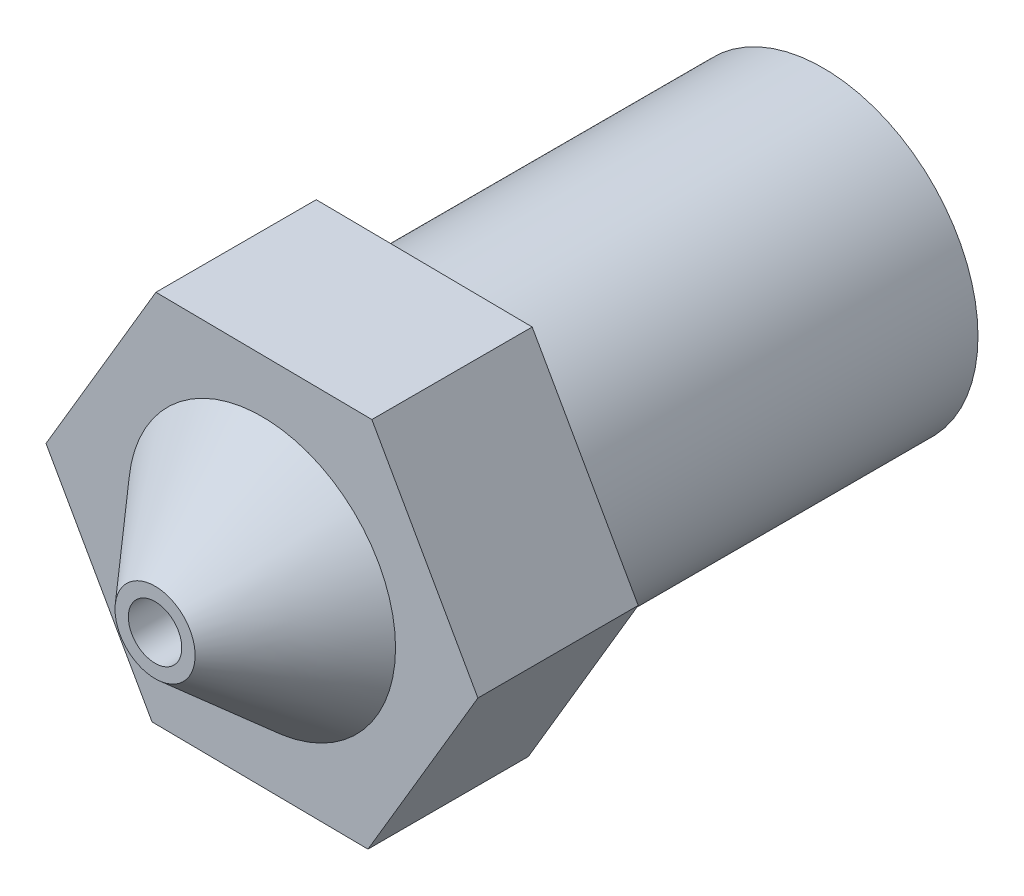
ISO-10303-21;
HEADER;
FILE_DESCRIPTION(('STEP AP214'),'2;1');
FILE_NAME('part.step','',(''),(''),'','','');
FILE_SCHEMA(('AUTOMOTIVE_DESIGN { 1 0 10303 214 1 1 1 1 }'));
ENDSEC;
DATA;
#1=APPLICATION_CONTEXT('core data for automotive mechanical design processes');
#2=APPLICATION_PROTOCOL_DEFINITION('international standard','automotive_design',2000,#1);
#3=PRODUCT_CONTEXT('',#1,'mechanical');
#4=PRODUCT('Part','Part','',(#3));
#5=PRODUCT_RELATED_PRODUCT_CATEGORY('part','',(#4));
#6=PRODUCT_DEFINITION_FORMATION('','',#4);
#7=PRODUCT_DEFINITION_CONTEXT('part definition',#1,'design');
#8=PRODUCT_DEFINITION('design','',#6,#7);
#9=PRODUCT_DEFINITION_SHAPE('','',#8);
#10=(LENGTH_UNIT() NAMED_UNIT(*) SI_UNIT(.MILLI.,.METRE.));
#11=(NAMED_UNIT(*) PLANE_ANGLE_UNIT() SI_UNIT($,.RADIAN.));
#12=(NAMED_UNIT(*) SI_UNIT($,.STERADIAN.) SOLID_ANGLE_UNIT());
#13=UNCERTAINTY_MEASURE_WITH_UNIT(LENGTH_MEASURE(1.E-05),#10,'distance_accuracy_value','');
#14=(GEOMETRIC_REPRESENTATION_CONTEXT(3) GLOBAL_UNCERTAINTY_ASSIGNED_CONTEXT((#13)) GLOBAL_UNIT_ASSIGNED_CONTEXT((#10,
#11,#12)) REPRESENTATION_CONTEXT('',''));
#15=CARTESIAN_POINT('',(0.,0.,0.));
#16=DIRECTION('',(0.,0.,1.));
#17=DIRECTION('',(1.,0.,0.));
#18=AXIS2_PLACEMENT_3D('',#15,#16,#17);
#19=CARTESIAN_POINT('',(-4.04123017720206,0.0423318816588313,3.));
#20=DIRECTION('',(0.871215107244233,0.490901453358432,0.));
#21=DIRECTION('',(-0.490901453358432,0.871215107244233,0.));
#22=AXIS2_PLACEMENT_3D('',#19,#20,#21);
#23=PLANE('',#22);
#24=DIRECTION('',(0.490901453358432,-0.871215107244232,0.));
#25=VECTOR('',#24,1.);
#26=CARTESIAN_POINT('',(-4.04123017720206,0.0423318816588313,0.));
#27=LINE('',#26,#25);
#28=CARTESIAN_POINT('',(-4.04123017720206,0.0423318816588313,0.));
#29=VERTEX_POINT('',#28);
#30=CARTESIAN_POINT('',(-2.05727557350757,-3.47864205516785,0.));
#31=VERTEX_POINT('',#30);
#32=EDGE_CURVE('E125',#29,#31,#27,.T.);
#33=ORIENTED_EDGE('',*,*,#32,.T.);
#34=DIRECTION('',(0.,0.,-1.));
#35=VECTOR('',#34,1.);
#36=CARTESIAN_POINT('',(-2.05727557350757,-3.47864205516785,3.));
#37=LINE('',#36,#35);
#38=CARTESIAN_POINT('',(-2.05727557350757,-3.47864205516785,3.));
#39=VERTEX_POINT('',#38);
#40=EDGE_CURVE('E42',#39,#31,#37,.T.);
#41=ORIENTED_EDGE('',*,*,#40,.F.);
#42=DIRECTION('',(0.490901453358432,-0.871215107244232,0.));
#43=VECTOR('',#42,1.);
#44=CARTESIAN_POINT('',(-4.04123017720206,0.0423318816588313,3.));
#45=LINE('',#44,#43);
#46=CARTESIAN_POINT('',(-4.04123017720206,0.0423318816588313,3.));
#47=VERTEX_POINT('',#46);
#48=EDGE_CURVE('E136',#47,#39,#45,.T.);
#49=ORIENTED_EDGE('',*,*,#48,.F.);
#50=DIRECTION('',(0.,0.,-1.));
#51=VECTOR('',#50,1.);
#52=CARTESIAN_POINT('',(-4.04123017720206,0.0423318816588313,3.));
#53=LINE('',#52,#51);
#54=EDGE_CURVE('E121',#47,#29,#53,.T.);
#55=ORIENTED_EDGE('',*,*,#54,.T.);
#56=EDGE_LOOP('',(#33,#41,#49,#55));
#57=FACE_BOUND('',#56,.T.);
#58=ADVANCED_FACE('F39',(#57),#23,.F.);
#59=CARTESIAN_POINT('',(-2.05727557350757,-3.47864205516785,3.));
#60=DIRECTION('',(0.0104744242590129,0.999945141713505,0.));
#61=DIRECTION('',(-0.999945141713505,0.0104744242590129,0.));
#62=AXIS2_PLACEMENT_3D('',#59,#60,#61);
#63=PLANE('',#62);
#64=DIRECTION('',(0.999945141713505,-0.0104744242590129,0.));
#65=VECTOR('',#64,1.);
#66=CARTESIAN_POINT('',(-2.05727557350757,-3.47864205516785,0.));
#67=LINE('',#66,#65);
#68=CARTESIAN_POINT('',(1.98395460369448,-3.52097393682668,0.));
#69=VERTEX_POINT('',#68);
#70=EDGE_CURVE('E128',#31,#69,#67,.T.);
#71=ORIENTED_EDGE('',*,*,#70,.T.);
#72=DIRECTION('',(0.,0.,-1.));
#73=VECTOR('',#72,1.);
#74=CARTESIAN_POINT('',(1.98395460369448,-3.52097393682668,3.));
#75=LINE('',#74,#73);
#76=CARTESIAN_POINT('',(1.98395460369448,-3.52097393682668,3.));
#77=VERTEX_POINT('',#76);
#78=EDGE_CURVE('E139',#77,#69,#75,.T.);
#79=ORIENTED_EDGE('',*,*,#78,.F.);
#80=DIRECTION('',(0.999945141713505,-0.0104744242590129,0.));
#81=VECTOR('',#80,1.);
#82=CARTESIAN_POINT('',(-2.05727557350757,-3.47864205516785,3.));
#83=LINE('',#82,#81);
#84=EDGE_CURVE('E94',#39,#77,#83,.T.);
#85=ORIENTED_EDGE('',*,*,#84,.F.);
#86=ORIENTED_EDGE('',*,*,#40,.T.);
#87=EDGE_LOOP('',(#71,#79,#85,#86));
#88=FACE_BOUND('',#87,.T.);
#89=ADVANCED_FACE('F144',(#88),#63,.F.);
#90=CARTESIAN_POINT('',(1.98395460369448,-3.52097393682668,3.));
#91=DIRECTION('',(-0.86074068298522,0.509043688355074,0.));
#92=DIRECTION('',(-0.509043688355074,-0.86074068298522,0.));
#93=AXIS2_PLACEMENT_3D('',#90,#91,#92);
#94=PLANE('',#93);
#95=DIRECTION('',(0.509043688355074,0.86074068298522,0.));
#96=VECTOR('',#95,1.);
#97=CARTESIAN_POINT('',(1.98395460369448,-3.52097393682668,0.));
#98=LINE('',#97,#96);
#99=CARTESIAN_POINT('',(4.04123017720205,-0.0423318816588313,0.));
#100=VERTEX_POINT('',#99);
#101=EDGE_CURVE('E131',#69,#100,#98,.T.);
#102=ORIENTED_EDGE('',*,*,#101,.T.);
#103=DIRECTION('',(0.,0.,-1.));
#104=VECTOR('',#103,1.);
#105=CARTESIAN_POINT('',(4.04123017720205,-0.0423318816588313,3.));
#106=LINE('',#105,#104);
#107=CARTESIAN_POINT('',(4.04123017720205,-0.0423318816588313,3.));
#108=VERTEX_POINT('',#107);
#109=EDGE_CURVE('E116',#108,#100,#106,.T.);
#110=ORIENTED_EDGE('',*,*,#109,.F.);
#111=DIRECTION('',(0.509043688355074,0.86074068298522,0.));
#112=VECTOR('',#111,1.);
#113=CARTESIAN_POINT('',(1.98395460369448,-3.52097393682668,3.));
#114=LINE('',#113,#112);
#115=EDGE_CURVE('E107',#77,#108,#114,.T.);
#116=ORIENTED_EDGE('',*,*,#115,.F.);
#117=ORIENTED_EDGE('',*,*,#78,.T.);
#118=EDGE_LOOP('',(#102,#110,#116,#117));
#119=FACE_BOUND('',#118,.T.);
#120=ADVANCED_FACE('F150',(#119),#94,.F.);
#121=CARTESIAN_POINT('',(4.04123017720205,-0.0423318816588313,3.));
#122=DIRECTION('',(-0.871215107244233,-0.490901453358432,0.));
#123=DIRECTION('',(0.490901453358432,-0.871215107244233,0.));
#124=AXIS2_PLACEMENT_3D('',#121,#122,#123);
#125=PLANE('',#124);
#126=DIRECTION('',(-0.490901453358432,0.871215107244233,0.));
#127=VECTOR('',#126,1.);
#128=CARTESIAN_POINT('',(4.04123017720205,-0.0423318816588313,0.));
#129=LINE('',#128,#127);
#130=CARTESIAN_POINT('',(2.05727557350757,3.47864205516785,0.));
#131=VERTEX_POINT('',#130);
#132=EDGE_CURVE('E115',#100,#131,#129,.T.);
#133=ORIENTED_EDGE('',*,*,#132,.T.);
#134=DIRECTION('',(0.,0.,-1.));
#135=VECTOR('',#134,1.);
#136=CARTESIAN_POINT('',(2.05727557350757,3.47864205516785,3.));
#137=LINE('',#136,#135);
#138=CARTESIAN_POINT('',(2.05727557350757,3.47864205516785,3.));
#139=VERTEX_POINT('',#138);
#140=EDGE_CURVE('E112',#139,#131,#137,.T.);
#141=ORIENTED_EDGE('',*,*,#140,.F.);
#142=DIRECTION('',(-0.490901453358432,0.871215107244233,0.));
#143=VECTOR('',#142,1.);
#144=CARTESIAN_POINT('',(4.04123017720205,-0.0423318816588313,3.));
#145=LINE('',#144,#143);
#146=EDGE_CURVE('E101',#108,#139,#145,.T.);
#147=ORIENTED_EDGE('',*,*,#146,.F.);
#148=ORIENTED_EDGE('',*,*,#109,.T.);
#149=EDGE_LOOP('',(#133,#141,#147,#148));
#150=FACE_BOUND('',#149,.T.);
#151=ADVANCED_FACE('F113',(#150),#125,.F.);
#152=CARTESIAN_POINT('',(2.05727557350757,3.47864205516785,3.));
#153=DIRECTION('',(-0.0104744242590133,-0.999945141713505,0.));
#154=DIRECTION('',(0.999945141713505,-0.0104744242590133,0.));
#155=AXIS2_PLACEMENT_3D('',#152,#153,#154);
#156=PLANE('',#155);
#157=DIRECTION('',(-0.999945141713505,0.0104744242590133,0.));
#158=VECTOR('',#157,1.);
#159=CARTESIAN_POINT('',(2.05727557350757,3.47864205516785,0.));
#160=LINE('',#159,#158);
#161=CARTESIAN_POINT('',(-1.98395460369448,3.52097393682669,0.));
#162=VERTEX_POINT('',#161);
#163=EDGE_CURVE('E79',#131,#162,#160,.T.);
#164=ORIENTED_EDGE('',*,*,#163,.T.);
#165=DIRECTION('',(0.,0.,-1.));
#166=VECTOR('',#165,1.);
#167=CARTESIAN_POINT('',(-1.98395460369448,3.52097393682669,3.));
#168=LINE('',#167,#166);
#169=CARTESIAN_POINT('',(-1.98395460369448,3.52097393682669,3.));
#170=VERTEX_POINT('',#169);
#171=EDGE_CURVE('E117',#170,#162,#168,.T.);
#172=ORIENTED_EDGE('',*,*,#171,.F.);
#173=DIRECTION('',(-0.999945141713505,0.0104744242590133,0.));
#174=VECTOR('',#173,1.);
#175=CARTESIAN_POINT('',(2.05727557350757,3.47864205516785,3.));
#176=LINE('',#175,#174);
#177=EDGE_CURVE('E105',#139,#170,#176,.T.);
#178=ORIENTED_EDGE('',*,*,#177,.F.);
#179=ORIENTED_EDGE('',*,*,#140,.T.);
#180=EDGE_LOOP('',(#164,#172,#178,#179));
#181=FACE_BOUND('',#180,.T.);
#182=ADVANCED_FACE('F119',(#181),#156,.F.);
#183=CARTESIAN_POINT('',(-1.98395460369448,3.52097393682669,3.));
#184=DIRECTION('',(0.86074068298522,-0.509043688355074,0.));
#185=DIRECTION('',(0.509043688355074,0.86074068298522,0.));
#186=AXIS2_PLACEMENT_3D('',#183,#184,#185);
#187=PLANE('',#186);
#188=DIRECTION('',(-0.509043688355074,-0.86074068298522,0.));
#189=VECTOR('',#188,1.);
#190=CARTESIAN_POINT('',(-1.98395460369448,3.52097393682669,0.));
#191=LINE('',#190,#189);
#192=EDGE_CURVE('E85',#162,#29,#191,.T.);
#193=ORIENTED_EDGE('',*,*,#192,.T.);
#194=ORIENTED_EDGE('',*,*,#54,.F.);
#195=DIRECTION('',(-0.509043688355074,-0.86074068298522,0.));
#196=VECTOR('',#195,1.);
#197=CARTESIAN_POINT('',(-1.98395460369448,3.52097393682669,3.));
#198=LINE('',#197,#196);
#199=EDGE_CURVE('E56',#170,#47,#198,.T.);
#200=ORIENTED_EDGE('',*,*,#199,.F.);
#201=ORIENTED_EDGE('',*,*,#171,.T.);
#202=EDGE_LOOP('',(#193,#194,#200,#201));
#203=FACE_BOUND('',#202,.T.);
#204=ADVANCED_FACE('F205',(#203),#187,.F.);
#205=CARTESIAN_POINT('',(0.,0.,3.));
#206=DIRECTION('',(0.,0.,1.));
#207=DIRECTION('',(1.,0.,0.));
#208=AXIS2_PLACEMENT_3D('',#205,#206,#207);
#209=PLANE('',#208);
#210=CARTESIAN_POINT('',(0.,0.,3.));
#211=DIRECTION('',(0.,0.,-1.));
#212=DIRECTION('',(-1.,0.,0.));
#213=AXIS2_PLACEMENT_3D('',#210,#211,#212);
#214=CIRCLE('',#213,2.5);
#215=CARTESIAN_POINT('',(-2.5,0.,3.));
#216=VERTEX_POINT('',#215);
#217=EDGE_CURVE('E159',#216,#216,#214,.T.);
#218=ORIENTED_EDGE('',*,*,#217,.T.);
#219=EDGE_LOOP('',(#218));
#220=FACE_BOUND('',#219,.T.);
#221=ORIENTED_EDGE('',*,*,#48,.T.);
#222=ORIENTED_EDGE('',*,*,#84,.T.);
#223=ORIENTED_EDGE('',*,*,#115,.T.);
#224=ORIENTED_EDGE('',*,*,#146,.T.);
#225=ORIENTED_EDGE('',*,*,#177,.T.);
#226=ORIENTED_EDGE('',*,*,#199,.T.);
#227=EDGE_LOOP('',(#221,#222,#223,#224,#225,#226));
#228=FACE_BOUND('',#227,.T.);
#229=ADVANCED_FACE('F103',(#220,#228),#209,.T.);
#230=CARTESIAN_POINT('',(0.,0.,0.));
#231=DIRECTION('',(0.,0.,1.));
#232=DIRECTION('',(1.,0.,0.));
#233=AXIS2_PLACEMENT_3D('',#230,#231,#232);
#234=PLANE('',#233);
#235=CARTESIAN_POINT('',(0.,0.,0.));
#236=DIRECTION('',(0.,0.,-1.));
#237=DIRECTION('',(-1.,0.,0.));
#238=AXIS2_PLACEMENT_3D('',#235,#236,#237);
#239=CIRCLE('',#238,2.9);
#240=CARTESIAN_POINT('',(-2.9,0.,0.));
#241=VERTEX_POINT('',#240);
#242=EDGE_CURVE('E11',#241,#241,#239,.T.);
#243=ORIENTED_EDGE('',*,*,#242,.F.);
#244=EDGE_LOOP('',(#243));
#245=FACE_BOUND('',#244,.T.);
#246=ORIENTED_EDGE('',*,*,#32,.F.);
#247=ORIENTED_EDGE('',*,*,#192,.F.);
#248=ORIENTED_EDGE('',*,*,#163,.F.);
#249=ORIENTED_EDGE('',*,*,#132,.F.);
#250=ORIENTED_EDGE('',*,*,#101,.F.);
#251=ORIENTED_EDGE('',*,*,#70,.F.);
#252=EDGE_LOOP('',(#246,#247,#248,#249,#250,#251));
#253=FACE_BOUND('',#252,.T.);
#254=ADVANCED_FACE('F149',(#245,#253),#234,.F.);
#255=CARTESIAN_POINT('',(0.,0.,0.));
#256=DIRECTION('',(0.,0.,-1.));
#257=DIRECTION('',(-1.,0.,0.));
#258=AXIS2_PLACEMENT_3D('',#255,#256,#257);
#259=CYLINDRICAL_SURFACE('',#258,0.5);
#260=CARTESIAN_POINT('',(0.,0.,3.));
#261=DIRECTION('',(0.,0.,-1.));
#262=DIRECTION('',(-1.,0.,0.));
#263=AXIS2_PLACEMENT_3D('',#260,#261,#262);
#264=CIRCLE('',#263,0.5);
#265=CARTESIAN_POINT('',(-0.5,0.,3.));
#266=VERTEX_POINT('',#265);
#267=EDGE_CURVE('E163',#266,#266,#264,.T.);
#268=ORIENTED_EDGE('',*,*,#267,.T.);
#269=EDGE_LOOP('',(#268));
#270=FACE_BOUND('',#269,.T.);
#271=CARTESIAN_POINT('',(0.,0.,5.));
#272=DIRECTION('',(0.,0.,-1.));
#273=DIRECTION('',(-1.,0.,0.));
#274=AXIS2_PLACEMENT_3D('',#271,#272,#273);
#275=CIRCLE('',#274,0.5);
#276=CARTESIAN_POINT('',(-0.499999999999999,0.,5.));
#277=VERTEX_POINT('',#276);
#278=EDGE_CURVE('E129',#277,#277,#275,.T.);
#279=ORIENTED_EDGE('',*,*,#278,.F.);
#280=EDGE_LOOP('',(#279));
#281=FACE_BOUND('',#280,.T.);
#282=ADVANCED_FACE('F185',(#270,#281),#259,.F.);
#283=CARTESIAN_POINT('',(-0.499999999999999,0.,5.));
#284=DIRECTION('',(0.,0.,1.));
#285=DIRECTION('',(1.,0.,0.));
#286=AXIS2_PLACEMENT_3D('',#283,#284,#285);
#287=PLANE('',#286);
#288=ORIENTED_EDGE('',*,*,#278,.T.);
#289=EDGE_LOOP('',(#288));
#290=FACE_BOUND('',#289,.T.);
#291=CARTESIAN_POINT('',(0.,0.,5.));
#292=DIRECTION('',(0.,0.,-1.));
#293=DIRECTION('',(-1.,0.,0.));
#294=AXIS2_PLACEMENT_3D('',#291,#292,#293);
#295=CIRCLE('',#294,0.75);
#296=CARTESIAN_POINT('',(-0.749999999999999,0.,5.));
#297=VERTEX_POINT('',#296);
#298=EDGE_CURVE('E156',#297,#297,#295,.T.);
#299=ORIENTED_EDGE('',*,*,#298,.F.);
#300=EDGE_LOOP('',(#299));
#301=FACE_BOUND('',#300,.T.);
#302=ADVANCED_FACE('F188',(#290,#301),#287,.T.);
#303=CARTESIAN_POINT('',(0.,0.,3.));
#304=DIRECTION('',(0.,0.,-1.));
#305=DIRECTION('',(-1.,0.,0.));
#306=AXIS2_PLACEMENT_3D('',#303,#304,#305);
#307=CONICAL_SURFACE('',#306,2.5,0.718829999621625);
#308=CARTESIAN_POINT('',(-0.749999999999999,0.,5.));
#309=CARTESIAN_POINT('',(-0.768229166666666,0.,4.97916666666667));
#310=CARTESIAN_POINT('',(-0.786458333333332,0.,4.95833333333333));
#311=CARTESIAN_POINT('',(-0.822916666666666,0.,4.91666666666667));
#312=CARTESIAN_POINT('',(-0.841145833333332,0.,4.89583333333333));
#313=CARTESIAN_POINT('',(-0.877604166666666,0.,4.85416666666667));
#314=CARTESIAN_POINT('',(-0.895833333333332,0.,4.83333333333333));
#315=CARTESIAN_POINT('',(-0.932291666666666,0.,4.79166666666667));
#316=CARTESIAN_POINT('',(-0.950520833333332,0.,4.77083333333333));
#317=CARTESIAN_POINT('',(-0.986979166666666,0.,4.72916666666667));
#318=CARTESIAN_POINT('',(-1.00520833333333,0.,4.70833333333333));
#319=CARTESIAN_POINT('',(-1.04166666666667,0.,4.66666666666667));
#320=CARTESIAN_POINT('',(-1.05989583333333,0.,4.64583333333333));
#321=CARTESIAN_POINT('',(-1.09635416666667,0.,4.60416666666667));
#322=CARTESIAN_POINT('',(-1.11458333333333,0.,4.58333333333333));
#323=CARTESIAN_POINT('',(-1.15104166666667,0.,4.54166666666667));
#324=CARTESIAN_POINT('',(-1.16927083333333,0.,4.52083333333333));
#325=CARTESIAN_POINT('',(-1.20572916666667,0.,4.47916666666667));
#326=CARTESIAN_POINT('',(-1.22395833333333,0.,4.45833333333333));
#327=CARTESIAN_POINT('',(-1.26041666666667,0.,4.41666666666667));
#328=CARTESIAN_POINT('',(-1.27864583333333,0.,4.39583333333333));
#329=CARTESIAN_POINT('',(-1.31510416666667,0.,4.35416666666667));
#330=CARTESIAN_POINT('',(-1.33333333333333,0.,4.33333333333333));
#331=CARTESIAN_POINT('',(-1.36979166666667,0.,4.29166666666667));
#332=CARTESIAN_POINT('',(-1.38802083333333,0.,4.27083333333333));
#333=CARTESIAN_POINT('',(-1.42447916666667,0.,4.22916666666667));
#334=CARTESIAN_POINT('',(-1.44270833333333,0.,4.20833333333333));
#335=CARTESIAN_POINT('',(-1.47916666666667,0.,4.16666666666667));
#336=CARTESIAN_POINT('',(-1.49739583333333,0.,4.14583333333333));
#337=CARTESIAN_POINT('',(-1.53385416666667,0.,4.10416666666667));
#338=CARTESIAN_POINT('',(-1.55208333333333,0.,4.08333333333333));
#339=CARTESIAN_POINT('',(-1.58854166666667,0.,4.04166666666667));
#340=CARTESIAN_POINT('',(-1.60677083333333,0.,4.02083333333333));
#341=CARTESIAN_POINT('',(-1.64322916666667,0.,3.97916666666667));
#342=CARTESIAN_POINT('',(-1.66145833333333,0.,3.95833333333333));
#343=CARTESIAN_POINT('',(-1.69791666666667,0.,3.91666666666667));
#344=CARTESIAN_POINT('',(-1.71614583333333,0.,3.89583333333333));
#345=CARTESIAN_POINT('',(-1.75260416666667,0.,3.85416666666667));
#346=CARTESIAN_POINT('',(-1.77083333333333,0.,3.83333333333333));
#347=CARTESIAN_POINT('',(-1.80729166666667,0.,3.79166666666667));
#348=CARTESIAN_POINT('',(-1.82552083333333,0.,3.77083333333333));
#349=CARTESIAN_POINT('',(-1.86197916666667,0.,3.72916666666667));
#350=CARTESIAN_POINT('',(-1.88020833333333,0.,3.70833333333333));
#351=CARTESIAN_POINT('',(-1.91666666666667,0.,3.66666666666667));
#352=CARTESIAN_POINT('',(-1.93489583333333,0.,3.64583333333333));
#353=CARTESIAN_POINT('',(-1.97135416666667,0.,3.60416666666667));
#354=CARTESIAN_POINT('',(-1.98958333333333,0.,3.58333333333333));
#355=CARTESIAN_POINT('',(-2.02604166666667,0.,3.54166666666667));
#356=CARTESIAN_POINT('',(-2.04427083333333,0.,3.52083333333333));
#357=CARTESIAN_POINT('',(-2.08072916666667,0.,3.47916666666667));
#358=CARTESIAN_POINT('',(-2.09895833333333,0.,3.45833333333333));
#359=CARTESIAN_POINT('',(-2.13541666666667,0.,3.41666666666667));
#360=CARTESIAN_POINT('',(-2.15364583333333,0.,3.39583333333333));
#361=CARTESIAN_POINT('',(-2.19010416666667,0.,3.35416666666667));
#362=CARTESIAN_POINT('',(-2.20833333333333,0.,3.33333333333333));
#363=CARTESIAN_POINT('',(-2.24479166666667,0.,3.29166666666667));
#364=CARTESIAN_POINT('',(-2.26302083333333,0.,3.27083333333333));
#365=CARTESIAN_POINT('',(-2.29947916666667,0.,3.22916666666667));
#366=CARTESIAN_POINT('',(-2.31770833333333,0.,3.20833333333333));
#367=CARTESIAN_POINT('',(-2.35416666666667,0.,3.16666666666667));
#368=CARTESIAN_POINT('',(-2.37239583333333,0.,3.14583333333333));
#369=CARTESIAN_POINT('',(-2.40885416666667,0.,3.10416666666667));
#370=CARTESIAN_POINT('',(-2.42708333333333,0.,3.08333333333333));
#371=CARTESIAN_POINT('',(-2.46354166666667,0.,3.04166666666667));
#372=CARTESIAN_POINT('',(-2.48177083333333,0.,3.02083333333333));
#373=CARTESIAN_POINT('',(-2.5,0.,3.));
#374=B_SPLINE_CURVE_WITH_KNOTS('',3,(#308,#309,#310,#311,#312,#313,#314,#315,#316,#317,#318,
#319,#320,#321,#322,#323,#324,#325,#326,#327,#328,#329,#330,#331,#332,#333,#334,#335,#336,#337,
#338,#339,#340,#341,#342,#343,#344,#345,#346,#347,#348,#349,#350,#351,#352,#353,#354,#355,#356,
#357,#358,#359,#360,#361,#362,#363,#364,#365,#366,#367,#368,#369,#370,#371,#372,#373),
.UNSPECIFIED.,.F.,.F.,(4,2,2,2,2,2,2,2,2,2,2,2,2,2,2,2,2,2,2,2,2,2,2,2,2,2,2,2,2,2,2,2,4),(0.,
0.0830480141619895,0.166096028323979,0.249144042485968,0.332192056647958,0.415240070809947,
0.498288084971937,0.581336099133926,0.664384113295916,0.747432127457905,0.830480141619895,
0.913528155781884,0.996576169943874,1.07962418410586,1.16267219826785,1.24572021242984,
1.32876822659183,1.41181624075382,1.49486425491581,1.5779122690778,1.66096028323979,
1.74400829740178,1.82705631156377,1.91010432572576,1.99315233988775,2.07620035404974,
2.15924836821173,2.24229638237371,2.3253443965357,2.40839241069769,2.49144042485968,
2.57448843902167,2.65753645318366),.UNSPECIFIED.);
#375=EDGE_CURVE('BSEAM194',#297,#216,#374,.T.);
#376=ORIENTED_EDGE('',*,*,#298,.T.);
#377=ORIENTED_EDGE('',*,*,#217,.F.);
#378=ORIENTED_EDGE('',*,*,#375,.T.);
#379=ORIENTED_EDGE('',*,*,#375,.F.);
#380=EDGE_LOOP('',(#376,#378,#377,#379));
#381=FACE_BOUND('',#380,.T.);
#382=ADVANCED_FACE('F194',(#381),#307,.T.);
#383=CARTESIAN_POINT('',(0.,0.,-7.5));
#384=DIRECTION('',(0.,0.,1.));
#385=DIRECTION('',(1.,0.,0.));
#386=AXIS2_PLACEMENT_3D('',#383,#384,#385);
#387=CYLINDRICAL_SURFACE('',#386,2.9);
#388=CARTESIAN_POINT('',(0.,0.,-7.5));
#389=DIRECTION('',(0.,0.,-1.));
#390=DIRECTION('',(-1.,0.,0.));
#391=AXIS2_PLACEMENT_3D('',#388,#389,#390);
#392=CIRCLE('',#391,2.9);
#393=CARTESIAN_POINT('',(-2.9,0.,-7.5));
#394=VERTEX_POINT('',#393);
#395=EDGE_CURVE('E162',#394,#394,#392,.T.);
#396=ORIENTED_EDGE('',*,*,#395,.F.);
#397=EDGE_LOOP('',(#396));
#398=FACE_BOUND('',#397,.T.);
#399=ORIENTED_EDGE('',*,*,#242,.T.);
#400=EDGE_LOOP('',(#399));
#401=FACE_BOUND('',#400,.T.);
#402=ADVANCED_FACE('F200',(#398,#401),#387,.T.);
#403=CARTESIAN_POINT('',(0.,0.,-7.5));
#404=DIRECTION('',(0.,0.,-1.));
#405=DIRECTION('',(-1.,0.,0.));
#406=AXIS2_PLACEMENT_3D('',#403,#404,#405);
#407=PLANE('',#406);
#408=CARTESIAN_POINT('',(0.,0.,-7.5));
#409=DIRECTION('',(0.,0.,-1.));
#410=DIRECTION('',(-1.,0.,0.));
#411=AXIS2_PLACEMENT_3D('',#408,#409,#410);
#412=CIRCLE('',#411,0.875);
#413=CARTESIAN_POINT('',(0.875,0.,-7.5));
#414=VERTEX_POINT('',#413);
#415=EDGE_CURVE('E165',#414,#414,#412,.F.);
#416=ORIENTED_EDGE('',*,*,#415,.T.);
#417=EDGE_LOOP('',(#416));
#418=FACE_BOUND('',#417,.T.);
#419=ORIENTED_EDGE('',*,*,#395,.T.);
#420=EDGE_LOOP('',(#419));
#421=FACE_BOUND('',#420,.T.);
#422=ADVANCED_FACE('F181',(#418,#421),#407,.T.);
#423=CARTESIAN_POINT('',(0.,0.,3.));
#424=DIRECTION('',(0.,0.,1.));
#425=DIRECTION('',(1.,0.,0.));
#426=AXIS2_PLACEMENT_3D('',#423,#424,#425);
#427=PLANE('',#426);
#428=CARTESIAN_POINT('',(0.,0.,3.));
#429=DIRECTION('',(0.,0.,1.));
#430=DIRECTION('',(1.,0.,0.));
#431=AXIS2_PLACEMENT_3D('',#428,#429,#430);
#432=CIRCLE('',#431,0.875);
#433=CARTESIAN_POINT('',(0.875,0.,3.));
#434=VERTEX_POINT('',#433);
#435=EDGE_CURVE('E171',#434,#434,#432,.T.);
#436=ORIENTED_EDGE('',*,*,#435,.F.);
#437=EDGE_LOOP('',(#436));
#438=FACE_BOUND('',#437,.T.);
#439=ORIENTED_EDGE('',*,*,#267,.F.);
#440=EDGE_LOOP('',(#439));
#441=FACE_BOUND('',#440,.T.);
#442=ADVANCED_FACE('F178',(#438,#441),#427,.F.);
#443=CARTESIAN_POINT('',(0.,0.,-9.97487373415292));
#444=DIRECTION('',(0.,0.,1.));
#445=DIRECTION('',(1.,0.,0.));
#446=AXIS2_PLACEMENT_3D('',#443,#444,#445);
#447=CYLINDRICAL_SURFACE('',#446,0.875);
#448=CARTESIAN_POINT('',(0.875,0.,3.));
#449=CARTESIAN_POINT('',(0.875,0.,2.890625));
#450=CARTESIAN_POINT('',(0.875,0.,2.78125));
#451=CARTESIAN_POINT('',(0.875,0.,2.5625));
#452=CARTESIAN_POINT('',(0.875,0.,2.453125));
#453=CARTESIAN_POINT('',(0.875,0.,2.234375));
#454=CARTESIAN_POINT('',(0.875,0.,2.125));
#455=CARTESIAN_POINT('',(0.875,0.,1.90625));
#456=CARTESIAN_POINT('',(0.875,0.,1.796875));
#457=CARTESIAN_POINT('',(0.875,0.,1.578125));
#458=CARTESIAN_POINT('',(0.875,0.,1.46875));
#459=CARTESIAN_POINT('',(0.875,0.,1.25));
#460=CARTESIAN_POINT('',(0.875,0.,1.140625));
#461=CARTESIAN_POINT('',(0.875,0.,0.921875000000001));
#462=CARTESIAN_POINT('',(0.875,0.,0.812500000000001));
#463=CARTESIAN_POINT('',(0.875,0.,0.593750000000001));
#464=CARTESIAN_POINT('',(0.875,0.,0.484375));
#465=CARTESIAN_POINT('',(0.875,0.,0.265625));
#466=CARTESIAN_POINT('',(0.875,0.,0.15625));
#467=CARTESIAN_POINT('',(0.875,0.,-0.0625000000000001));
#468=CARTESIAN_POINT('',(0.875,0.,-0.171875));
#469=CARTESIAN_POINT('',(0.875,0.,-0.390625));
#470=CARTESIAN_POINT('',(0.875,0.,-0.5));
#471=CARTESIAN_POINT('',(0.875,0.,-0.71875));
#472=CARTESIAN_POINT('',(0.875,0.,-0.828125));
#473=CARTESIAN_POINT('',(0.875,0.,-1.046875));
#474=CARTESIAN_POINT('',(0.875,0.,-1.15625));
#475=CARTESIAN_POINT('',(0.875,0.,-1.375));
#476=CARTESIAN_POINT('',(0.875,0.,-1.484375));
#477=CARTESIAN_POINT('',(0.875,0.,-1.703125));
#478=CARTESIAN_POINT('',(0.875,0.,-1.8125));
#479=CARTESIAN_POINT('',(0.875,0.,-2.03125));
#480=CARTESIAN_POINT('',(0.875,0.,-2.140625));
#481=CARTESIAN_POINT('',(0.875,0.,-2.359375));
#482=CARTESIAN_POINT('',(0.875,0.,-2.46875));
#483=CARTESIAN_POINT('',(0.875,0.,-2.6875));
#484=CARTESIAN_POINT('',(0.875,0.,-2.796875));
#485=CARTESIAN_POINT('',(0.875,0.,-3.015625));
#486=CARTESIAN_POINT('',(0.875,0.,-3.125));
#487=CARTESIAN_POINT('',(0.875,0.,-3.34375));
#488=CARTESIAN_POINT('',(0.875,0.,-3.453125));
#489=CARTESIAN_POINT('',(0.875,0.,-3.671875));
#490=CARTESIAN_POINT('',(0.875,0.,-3.78125));
#491=CARTESIAN_POINT('',(0.875,0.,-4.));
#492=CARTESIAN_POINT('',(0.875,0.,-4.109375));
#493=CARTESIAN_POINT('',(0.875,0.,-4.328125));
#494=CARTESIAN_POINT('',(0.875,0.,-4.4375));
#495=CARTESIAN_POINT('',(0.875,0.,-4.65625));
#496=CARTESIAN_POINT('',(0.875,0.,-4.765625));
#497=CARTESIAN_POINT('',(0.875,0.,-4.984375));
#498=CARTESIAN_POINT('',(0.875,0.,-5.09375));
#499=CARTESIAN_POINT('',(0.875,0.,-5.3125));
#500=CARTESIAN_POINT('',(0.875,0.,-5.421875));
#501=CARTESIAN_POINT('',(0.875,0.,-5.640625));
#502=CARTESIAN_POINT('',(0.875,0.,-5.75));
#503=CARTESIAN_POINT('',(0.875,0.,-5.96875));
#504=CARTESIAN_POINT('',(0.875,0.,-6.078125));
#505=CARTESIAN_POINT('',(0.875,0.,-6.296875));
#506=CARTESIAN_POINT('',(0.875,0.,-6.40625));
#507=CARTESIAN_POINT('',(0.875,0.,-6.625));
#508=CARTESIAN_POINT('',(0.875,0.,-6.734375));
#509=CARTESIAN_POINT('',(0.875,0.,-6.953125));
#510=CARTESIAN_POINT('',(0.875,0.,-7.0625));
#511=CARTESIAN_POINT('',(0.875,0.,-7.28125));
#512=CARTESIAN_POINT('',(0.875,0.,-7.390625));
#513=CARTESIAN_POINT('',(0.875,0.,-7.5));
#514=B_SPLINE_CURVE_WITH_KNOTS('',3,(#448,#449,#450,#451,#452,#453,#454,#455,#456,#457,#458,
#459,#460,#461,#462,#463,#464,#465,#466,#467,#468,#469,#470,#471,#472,#473,#474,#475,#476,#477,
#478,#479,#480,#481,#482,#483,#484,#485,#486,#487,#488,#489,#490,#491,#492,#493,#494,#495,#496,
#497,#498,#499,#500,#501,#502,#503,#504,#505,#506,#507,#508,#509,#510,#511,#512,#513),
.UNSPECIFIED.,.F.,.F.,(4,2,2,2,2,2,2,2,2,2,2,2,2,2,2,2,2,2,2,2,2,2,2,2,2,2,2,2,2,2,2,2,4),(0.,
0.328125,0.656250000000001,0.984375000000001,1.3125,1.640625,1.96875,2.296875,2.625,2.953125,
3.28125,3.609375,3.9375,4.265625,4.59375,4.921875,5.25,5.578125,5.90625,6.234375,6.5625,
6.890625,7.21875,7.546875,7.875,8.203125,8.53125,8.859375,9.1875,9.515625,9.84375,10.171875,
10.5),.UNSPECIFIED.);
#515=EDGE_CURVE('BSEAM175',#434,#414,#514,.T.);
#516=ORIENTED_EDGE('',*,*,#435,.T.);
#517=ORIENTED_EDGE('',*,*,#415,.F.);
#518=ORIENTED_EDGE('',*,*,#515,.T.);
#519=ORIENTED_EDGE('',*,*,#515,.F.);
#520=EDGE_LOOP('',(#516,#518,#517,#519));
#521=FACE_BOUND('',#520,.T.);
#522=ADVANCED_FACE('F175',(#521),#447,.F.);
#523=CLOSED_SHELL('',(#58,#89,#120,#151,#182,#204,#229,#254,#282,#302,#382,#402,#422,#442,#522));
#524=MANIFOLD_SOLID_BREP('B2',#523);
#525=ADVANCED_BREP_SHAPE_REPRESENTATION('',(#18,#524),#14);
#526=SHAPE_DEFINITION_REPRESENTATION(#9,#525);
ENDSEC;
END-ISO-10303-21;
